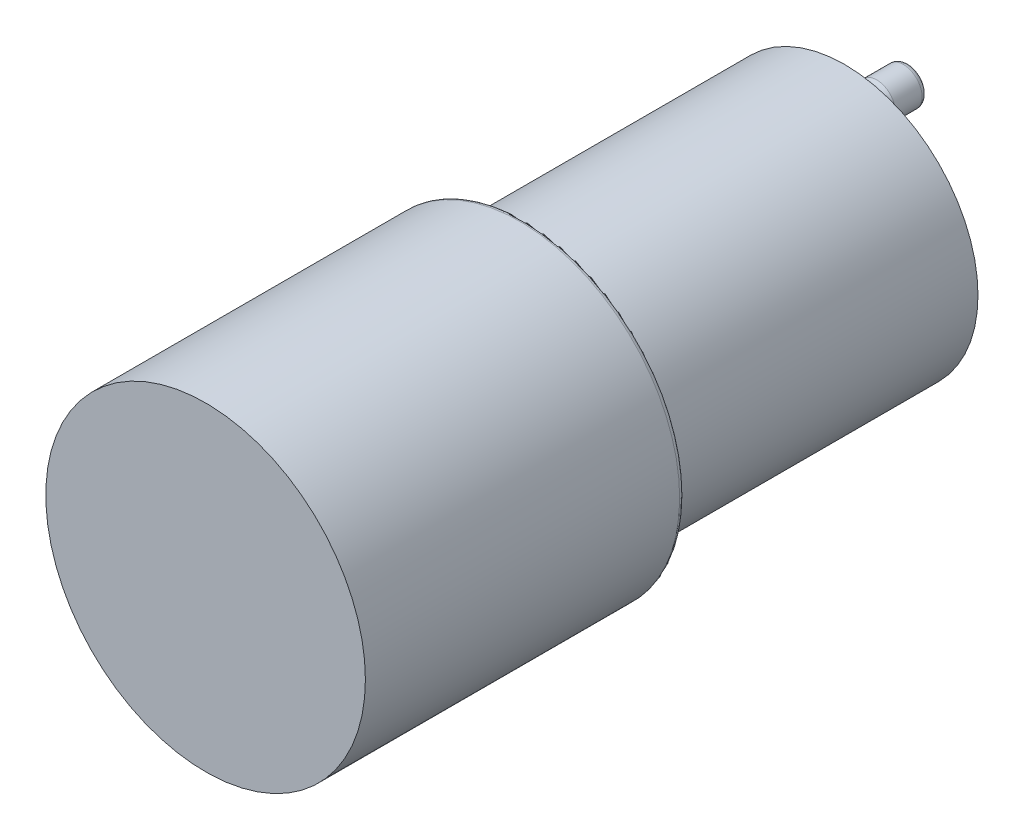
ISO-10303-21;
HEADER;
FILE_DESCRIPTION(('STEP AP214'),'2;1');
FILE_NAME('part.step','',(''),(''),'','','');
FILE_SCHEMA(('AUTOMOTIVE_DESIGN { 1 0 10303 214 1 1 1 1 }'));
ENDSEC;
DATA;
#1=APPLICATION_CONTEXT('core data for automotive mechanical design processes');
#2=APPLICATION_PROTOCOL_DEFINITION('international standard','automotive_design',2000,#1);
#3=PRODUCT_CONTEXT('',#1,'mechanical');
#4=PRODUCT('Part','Part','',(#3));
#5=PRODUCT_RELATED_PRODUCT_CATEGORY('part','',(#4));
#6=PRODUCT_DEFINITION_FORMATION('','',#4);
#7=PRODUCT_DEFINITION_CONTEXT('part definition',#1,'design');
#8=PRODUCT_DEFINITION('design','',#6,#7);
#9=PRODUCT_DEFINITION_SHAPE('','',#8);
#10=(LENGTH_UNIT() NAMED_UNIT(*) SI_UNIT(.MILLI.,.METRE.));
#11=(NAMED_UNIT(*) PLANE_ANGLE_UNIT() SI_UNIT($,.RADIAN.));
#12=(NAMED_UNIT(*) SI_UNIT($,.STERADIAN.) SOLID_ANGLE_UNIT());
#13=UNCERTAINTY_MEASURE_WITH_UNIT(LENGTH_MEASURE(1.E-05),#10,'distance_accuracy_value','');
#14=(GEOMETRIC_REPRESENTATION_CONTEXT(3) GLOBAL_UNCERTAINTY_ASSIGNED_CONTEXT((#13)) GLOBAL_UNIT_ASSIGNED_CONTEXT((#10,
#11,#12)) REPRESENTATION_CONTEXT('',''));
#15=CARTESIAN_POINT('',(0.,0.,0.));
#16=DIRECTION('',(0.,0.,1.));
#17=DIRECTION('',(1.,0.,0.));
#18=AXIS2_PLACEMENT_3D('',#15,#16,#17);
#19=CARTESIAN_POINT('',(0.,0.,60.));
#20=DIRECTION('',(0.,0.,-1.));
#21=DIRECTION('',(-1.,0.,0.));
#22=AXIS2_PLACEMENT_3D('',#19,#20,#21);
#23=CYLINDRICAL_SURFACE('',#22,12.5);
#24=CARTESIAN_POINT('',(0.,0.,29.5));
#25=DIRECTION('',(0.,0.,1.));
#26=DIRECTION('',(1.,0.,0.));
#27=AXIS2_PLACEMENT_3D('',#24,#25,#26);
#28=CIRCLE('',#27,12.5);
#29=CARTESIAN_POINT('',(12.5,0.,29.5));
#30=VERTEX_POINT('',#29);
#31=EDGE_CURVE('E42',#30,#30,#28,.F.);
#32=ORIENTED_EDGE('',*,*,#31,.T.);
#33=EDGE_LOOP('',(#32));
#34=FACE_BOUND('',#33,.T.);
#35=CARTESIAN_POINT('',(0.,0.,0.));
#36=DIRECTION('',(0.,0.,1.));
#37=DIRECTION('',(1.,0.,0.));
#38=AXIS2_PLACEMENT_3D('',#35,#36,#37);
#39=CIRCLE('',#38,12.5);
#40=CARTESIAN_POINT('',(12.5,0.,0.));
#41=VERTEX_POINT('',#40);
#42=EDGE_CURVE('E75',#41,#41,#39,.T.);
#43=ORIENTED_EDGE('',*,*,#42,.T.);
#44=EDGE_LOOP('',(#43));
#45=FACE_BOUND('',#44,.T.);
#46=ADVANCED_FACE('F31',(#34,#45),#23,.T.);
#47=CARTESIAN_POINT('',(0.,0.,0.));
#48=DIRECTION('',(0.,0.,1.));
#49=DIRECTION('',(1.,0.,0.));
#50=AXIS2_PLACEMENT_3D('',#47,#48,#49);
#51=PLANE('',#50);
#52=CARTESIAN_POINT('',(0.,8.,0.));
#53=DIRECTION('',(0.,0.,1.));
#54=DIRECTION('',(1.,0.,0.));
#55=AXIS2_PLACEMENT_3D('',#52,#53,#54);
#56=CIRCLE('',#55,1.5);
#57=CARTESIAN_POINT('',(1.5,8.,0.));
#58=VERTEX_POINT('',#57);
#59=EDGE_CURVE('E69',#58,#58,#56,.F.);
#60=ORIENTED_EDGE('',*,*,#59,.F.);
#61=EDGE_LOOP('',(#60));
#62=FACE_BOUND('',#61,.T.);
#63=CARTESIAN_POINT('',(0.,0.,0.));
#64=DIRECTION('',(0.,0.,1.));
#65=DIRECTION('',(1.,0.,0.));
#66=AXIS2_PLACEMENT_3D('',#63,#64,#65);
#67=CIRCLE('',#66,1.5);
#68=CARTESIAN_POINT('',(1.5,0.,0.));
#69=VERTEX_POINT('',#68);
#70=EDGE_CURVE('E72',#69,#69,#67,.F.);
#71=ORIENTED_EDGE('',*,*,#70,.F.);
#72=EDGE_LOOP('',(#71));
#73=FACE_BOUND('',#72,.T.);
#74=ORIENTED_EDGE('',*,*,#42,.F.);
#75=EDGE_LOOP('',(#74));
#76=FACE_BOUND('',#75,.T.);
#77=ADVANCED_FACE('F105',(#62,#73,#76),#51,.F.);
#78=CARTESIAN_POINT('',(0.,0.,-3.));
#79=DIRECTION('',(0.,0.,1.));
#80=DIRECTION('',(1.,0.,0.));
#81=AXIS2_PLACEMENT_3D('',#78,#79,#80);
#82=CYLINDRICAL_SURFACE('',#81,1.5);
#83=CARTESIAN_POINT('',(0.,0.,-0.777951395671102));
#84=DIRECTION('',(0.,0.,-1.));
#85=DIRECTION('',(-1.,0.,0.));
#86=AXIS2_PLACEMENT_3D('',#83,#84,#85);
#87=CIRCLE('',#86,1.5);
#88=CARTESIAN_POINT('',(-1.5,0.,-0.777951395671102));
#89=VERTEX_POINT('',#88);
#90=EDGE_CURVE('E63',#89,#89,#87,.F.);
#91=ORIENTED_EDGE('',*,*,#90,.T.);
#92=EDGE_LOOP('',(#91));
#93=FACE_BOUND('',#92,.T.);
#94=ORIENTED_EDGE('',*,*,#70,.T.);
#95=EDGE_LOOP('',(#94));
#96=FACE_BOUND('',#95,.T.);
#97=ADVANCED_FACE('F111',(#93,#96),#82,.T.);
#98=CARTESIAN_POINT('',(0.,8.,-3.));
#99=DIRECTION('',(0.,0.,1.));
#100=DIRECTION('',(1.,0.,0.));
#101=AXIS2_PLACEMENT_3D('',#98,#99,#100);
#102=CYLINDRICAL_SURFACE('',#101,1.5);
#103=CARTESIAN_POINT('',(0.,8.,-0.777951395671102));
#104=DIRECTION('',(0.,0.,-1.));
#105=DIRECTION('',(-1.,0.,0.));
#106=AXIS2_PLACEMENT_3D('',#103,#104,#105);
#107=CIRCLE('',#106,1.5);
#108=CARTESIAN_POINT('',(-1.5,8.,-0.777951395671102));
#109=VERTEX_POINT('',#108);
#110=EDGE_CURVE('E66',#109,#109,#107,.F.);
#111=ORIENTED_EDGE('',*,*,#110,.T.);
#112=EDGE_LOOP('',(#111));
#113=FACE_BOUND('',#112,.T.);
#114=ORIENTED_EDGE('',*,*,#59,.T.);
#115=EDGE_LOOP('',(#114));
#116=FACE_BOUND('',#115,.T.);
#117=ADVANCED_FACE('F145',(#113,#116),#102,.T.);
#118=CARTESIAN_POINT('',(0.,0.,-6.));
#119=DIRECTION('',(0.,0.,1.));
#120=DIRECTION('',(1.,0.,0.));
#121=AXIS2_PLACEMENT_3D('',#118,#119,#120);
#122=CYLINDRICAL_SURFACE('',#121,1.75);
#123=CARTESIAN_POINT('',(0.,0.,-5.5));
#124=DIRECTION('',(0.,0.,-1.));
#125=DIRECTION('',(-1.,0.,0.));
#126=AXIS2_PLACEMENT_3D('',#123,#124,#125);
#127=CIRCLE('',#126,1.75);
#128=CARTESIAN_POINT('',(-1.75,0.,-5.5));
#129=VERTEX_POINT('',#128);
#130=EDGE_CURVE('E57',#129,#129,#127,.F.);
#131=ORIENTED_EDGE('',*,*,#130,.T.);
#132=EDGE_LOOP('',(#131));
#133=FACE_BOUND('',#132,.T.);
#134=CARTESIAN_POINT('',(0.,0.,-3.));
#135=DIRECTION('',(0.,0.,-1.));
#136=DIRECTION('',(-1.,0.,0.));
#137=AXIS2_PLACEMENT_3D('',#134,#135,#136);
#138=CIRCLE('',#137,1.75);
#139=CARTESIAN_POINT('',(-1.75,0.,-3.));
#140=VERTEX_POINT('',#139);
#141=EDGE_CURVE('E78',#140,#140,#138,.T.);
#142=ORIENTED_EDGE('',*,*,#141,.T.);
#143=EDGE_LOOP('',(#142));
#144=FACE_BOUND('',#143,.T.);
#145=ADVANCED_FACE('F149',(#133,#144),#122,.T.);
#146=CARTESIAN_POINT('',(0.,0.,-6.));
#147=DIRECTION('',(0.,0.,-1.));
#148=DIRECTION('',(-1.,0.,0.));
#149=AXIS2_PLACEMENT_3D('',#146,#147,#148);
#150=PLANE('',#149);
#151=CARTESIAN_POINT('',(0.,0.,-6.));
#152=DIRECTION('',(0.,0.,-1.));
#153=DIRECTION('',(-1.,0.,0.));
#154=AXIS2_PLACEMENT_3D('',#151,#152,#153);
#155=CIRCLE('',#154,1.25);
#156=CARTESIAN_POINT('',(-1.25,0.,-6.));
#157=VERTEX_POINT('',#156);
#158=EDGE_CURVE('E60',#157,#157,#155,.T.);
#159=ORIENTED_EDGE('',*,*,#158,.T.);
#160=EDGE_LOOP('',(#159));
#161=FACE_BOUND('',#160,.T.);
#162=ADVANCED_FACE('F153',(#161),#150,.T.);
#163=CARTESIAN_POINT('',(0.,8.,-6.));
#164=DIRECTION('',(0.,0.,1.));
#165=DIRECTION('',(1.,0.,0.));
#166=AXIS2_PLACEMENT_3D('',#163,#164,#165);
#167=CYLINDRICAL_SURFACE('',#166,1.75);
#168=CARTESIAN_POINT('',(0.,8.,-5.5));
#169=DIRECTION('',(0.,0.,-1.));
#170=DIRECTION('',(-1.,0.,0.));
#171=AXIS2_PLACEMENT_3D('',#168,#169,#170);
#172=CIRCLE('',#171,1.75);
#173=CARTESIAN_POINT('',(-1.75,8.,-5.5));
#174=VERTEX_POINT('',#173);
#175=EDGE_CURVE('E51',#174,#174,#172,.F.);
#176=ORIENTED_EDGE('',*,*,#175,.T.);
#177=EDGE_LOOP('',(#176));
#178=FACE_BOUND('',#177,.T.);
#179=CARTESIAN_POINT('',(0.,8.,-3.));
#180=DIRECTION('',(0.,0.,-1.));
#181=DIRECTION('',(-1.,0.,0.));
#182=AXIS2_PLACEMENT_3D('',#179,#180,#181);
#183=CIRCLE('',#182,1.75);
#184=CARTESIAN_POINT('',(-1.75,8.,-3.));
#185=VERTEX_POINT('',#184);
#186=EDGE_CURVE('E81',#185,#185,#183,.T.);
#187=ORIENTED_EDGE('',*,*,#186,.T.);
#188=EDGE_LOOP('',(#187));
#189=FACE_BOUND('',#188,.T.);
#190=ADVANCED_FACE('F157',(#178,#189),#167,.T.);
#191=CARTESIAN_POINT('',(0.,8.,-6.));
#192=DIRECTION('',(0.,0.,-1.));
#193=DIRECTION('',(-1.,0.,0.));
#194=AXIS2_PLACEMENT_3D('',#191,#192,#193);
#195=PLANE('',#194);
#196=CARTESIAN_POINT('',(0.,8.,-6.));
#197=DIRECTION('',(0.,0.,-1.));
#198=DIRECTION('',(-1.,0.,0.));
#199=AXIS2_PLACEMENT_3D('',#196,#197,#198);
#200=CIRCLE('',#199,1.25);
#201=CARTESIAN_POINT('',(-1.25,8.,-6.));
#202=VERTEX_POINT('',#201);
#203=EDGE_CURVE('E54',#202,#202,#200,.T.);
#204=ORIENTED_EDGE('',*,*,#203,.T.);
#205=EDGE_LOOP('',(#204));
#206=FACE_BOUND('',#205,.T.);
#207=ADVANCED_FACE('F121',(#206),#195,.T.);
#208=CARTESIAN_POINT('',(0.,8.,-0.777951395671102));
#209=DIRECTION('',(0.,0.,-1.));
#210=DIRECTION('',(-1.,0.,0.));
#211=AXIS2_PLACEMENT_3D('',#208,#209,#210);
#212=TOROIDAL_SURFACE('',#211,11.5,10.);
#213=ORIENTED_EDGE('',*,*,#110,.F.);
#214=EDGE_LOOP('',(#213));
#215=FACE_BOUND('',#214,.T.);
#216=ORIENTED_EDGE('',*,*,#186,.F.);
#217=EDGE_LOOP('',(#216));
#218=FACE_BOUND('',#217,.T.);
#219=ADVANCED_FACE('F117',(#215,#218),#212,.F.);
#220=CARTESIAN_POINT('',(0.,0.,-0.777951395671102));
#221=DIRECTION('',(0.,0.,-1.));
#222=DIRECTION('',(-1.,0.,0.));
#223=AXIS2_PLACEMENT_3D('',#220,#221,#222);
#224=TOROIDAL_SURFACE('',#223,11.5,10.);
#225=ORIENTED_EDGE('',*,*,#90,.F.);
#226=EDGE_LOOP('',(#225));
#227=FACE_BOUND('',#226,.T.);
#228=ORIENTED_EDGE('',*,*,#141,.F.);
#229=EDGE_LOOP('',(#228));
#230=FACE_BOUND('',#229,.T.);
#231=ADVANCED_FACE('F120',(#227,#230),#224,.F.);
#232=CARTESIAN_POINT('',(0.,0.,-5.5));
#233=DIRECTION('',(0.,0.,-1.));
#234=DIRECTION('',(-1.,0.,0.));
#235=AXIS2_PLACEMENT_3D('',#232,#233,#234);
#236=TOROIDAL_SURFACE('',#235,1.25,0.5);
#237=ORIENTED_EDGE('',*,*,#130,.F.);
#238=EDGE_LOOP('',(#237));
#239=FACE_BOUND('',#238,.T.);
#240=ORIENTED_EDGE('',*,*,#158,.F.);
#241=EDGE_LOOP('',(#240));
#242=FACE_BOUND('',#241,.T.);
#243=ADVANCED_FACE('F100',(#239,#242),#236,.T.);
#244=CARTESIAN_POINT('',(0.,8.,-5.5));
#245=DIRECTION('',(0.,0.,-1.));
#246=DIRECTION('',(-1.,0.,0.));
#247=AXIS2_PLACEMENT_3D('',#244,#245,#246);
#248=TOROIDAL_SURFACE('',#247,1.25,0.5);
#249=ORIENTED_EDGE('',*,*,#175,.F.);
#250=EDGE_LOOP('',(#249));
#251=FACE_BOUND('',#250,.T.);
#252=ORIENTED_EDGE('',*,*,#203,.F.);
#253=EDGE_LOOP('',(#252));
#254=FACE_BOUND('',#253,.T.);
#255=ADVANCED_FACE('F93',(#251,#254),#248,.T.);
#256=CARTESIAN_POINT('',(0.,0.,30.));
#257=DIRECTION('',(0.,0.,1.));
#258=DIRECTION('',(1.,0.,0.));
#259=AXIS2_PLACEMENT_3D('',#256,#257,#258);
#260=CYLINDRICAL_SURFACE('',#259,15.);
#261=CARTESIAN_POINT('',(0.,0.,30.5));
#262=DIRECTION('',(0.,0.,1.));
#263=DIRECTION('',(1.,0.,0.));
#264=AXIS2_PLACEMENT_3D('',#261,#262,#263);
#265=CIRCLE('',#264,15.);
#266=CARTESIAN_POINT('',(15.,0.,30.5));
#267=VERTEX_POINT('',#266);
#268=EDGE_CURVE('E38',#267,#267,#265,.T.);
#269=ORIENTED_EDGE('',*,*,#268,.T.);
#270=EDGE_LOOP('',(#269));
#271=FACE_BOUND('',#270,.T.);
#272=CARTESIAN_POINT('',(0.,0.,60.));
#273=DIRECTION('',(0.,0.,1.));
#274=DIRECTION('',(1.,0.,0.));
#275=AXIS2_PLACEMENT_3D('',#272,#273,#274);
#276=CIRCLE('',#275,15.);
#277=CARTESIAN_POINT('',(15.,0.,60.));
#278=VERTEX_POINT('',#277);
#279=EDGE_CURVE('E84',#278,#278,#276,.T.);
#280=ORIENTED_EDGE('',*,*,#279,.F.);
#281=EDGE_LOOP('',(#280));
#282=FACE_BOUND('',#281,.T.);
#283=ADVANCED_FACE('F90',(#271,#282),#260,.T.);
#284=CARTESIAN_POINT('',(0.,0.,30.));
#285=DIRECTION('',(0.,0.,1.));
#286=DIRECTION('',(1.,0.,0.));
#287=AXIS2_PLACEMENT_3D('',#284,#285,#286);
#288=PLANE('',#287);
#289=CARTESIAN_POINT('',(0.,0.,30.));
#290=DIRECTION('',(0.,0.,1.));
#291=DIRECTION('',(1.,0.,0.));
#292=AXIS2_PLACEMENT_3D('',#289,#290,#291);
#293=CIRCLE('',#292,14.5);
#294=CARTESIAN_POINT('',(14.5,0.,30.));
#295=VERTEX_POINT('',#294);
#296=EDGE_CURVE('E10',#295,#295,#293,.F.);
#297=ORIENTED_EDGE('',*,*,#296,.T.);
#298=EDGE_LOOP('',(#297));
#299=FACE_BOUND('',#298,.T.);
#300=CARTESIAN_POINT('',(0.,0.,30.));
#301=DIRECTION('',(0.,0.,1.));
#302=DIRECTION('',(1.,0.,0.));
#303=AXIS2_PLACEMENT_3D('',#300,#301,#302);
#304=CIRCLE('',#303,13.);
#305=CARTESIAN_POINT('',(13.,0.,30.));
#306=VERTEX_POINT('',#305);
#307=EDGE_CURVE('E46',#306,#306,#304,.T.);
#308=ORIENTED_EDGE('',*,*,#307,.T.);
#309=EDGE_LOOP('',(#308));
#310=FACE_BOUND('',#309,.T.);
#311=ADVANCED_FACE('F92',(#299,#310),#288,.F.);
#312=CARTESIAN_POINT('',(0.,0.,60.));
#313=DIRECTION('',(0.,0.,1.));
#314=DIRECTION('',(1.,0.,0.));
#315=AXIS2_PLACEMENT_3D('',#312,#313,#314);
#316=PLANE('',#315);
#317=ORIENTED_EDGE('',*,*,#279,.T.);
#318=EDGE_LOOP('',(#317));
#319=FACE_BOUND('',#318,.T.);
#320=ADVANCED_FACE('F88',(#319),#316,.T.);
#321=CARTESIAN_POINT('',(0.,0.,29.5));
#322=DIRECTION('',(0.,0.,1.));
#323=DIRECTION('',(1.,0.,0.));
#324=AXIS2_PLACEMENT_3D('',#321,#322,#323);
#325=TOROIDAL_SURFACE('',#324,13.,0.5);
#326=ORIENTED_EDGE('',*,*,#31,.F.);
#327=EDGE_LOOP('',(#326));
#328=FACE_BOUND('',#327,.T.);
#329=ORIENTED_EDGE('',*,*,#307,.F.);
#330=EDGE_LOOP('',(#329));
#331=FACE_BOUND('',#330,.T.);
#332=ADVANCED_FACE('F128',(#328,#331),#325,.F.);
#333=CARTESIAN_POINT('',(0.,0.,30.5));
#334=DIRECTION('',(0.,0.,1.));
#335=DIRECTION('',(1.,0.,0.));
#336=AXIS2_PLACEMENT_3D('',#333,#334,#335);
#337=TOROIDAL_SURFACE('',#336,14.5,0.5);
#338=ORIENTED_EDGE('',*,*,#296,.F.);
#339=EDGE_LOOP('',(#338));
#340=FACE_BOUND('',#339,.T.);
#341=ORIENTED_EDGE('',*,*,#268,.F.);
#342=EDGE_LOOP('',(#341));
#343=FACE_BOUND('',#342,.T.);
#344=ADVANCED_FACE('F33',(#340,#343),#337,.T.);
#345=CLOSED_SHELL('',(#46,#77,#97,#117,#145,#162,#190,#207,#219,#231,#243,#255,#283,#311,#320,
#332,#344));
#346=MANIFOLD_SOLID_BREP('B2',#345);
#347=ADVANCED_BREP_SHAPE_REPRESENTATION('',(#18,#346),#14);
#348=SHAPE_DEFINITION_REPRESENTATION(#9,#347);
ENDSEC;
END-ISO-10303-21;
